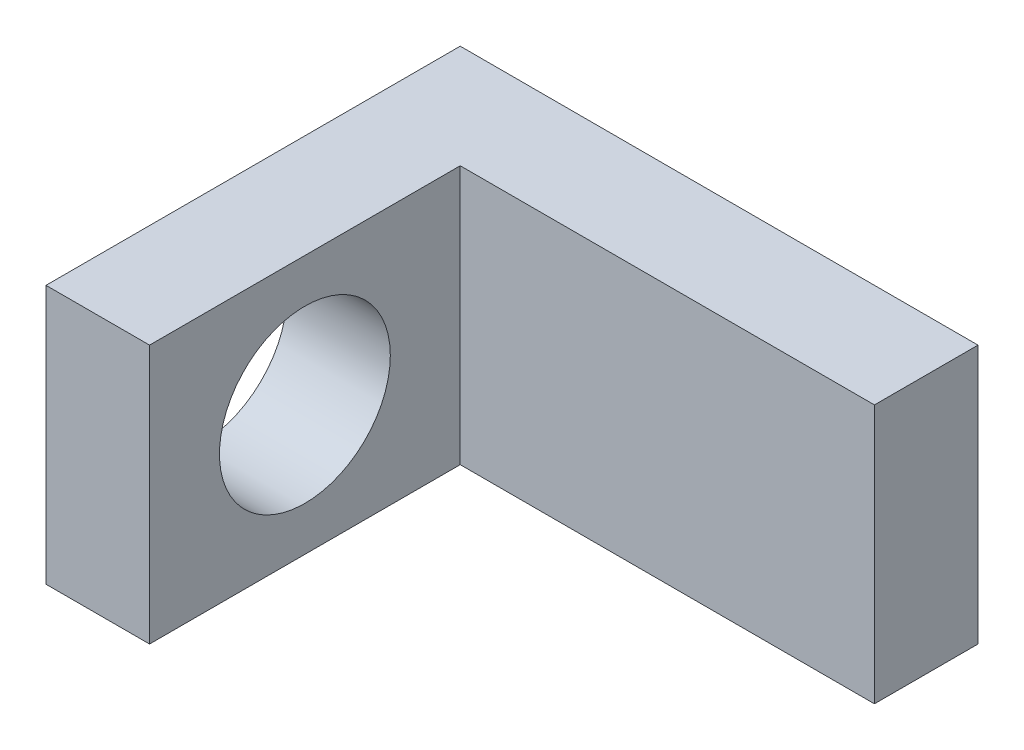
ISO-10303-21;
HEADER;
FILE_DESCRIPTION(('STEP AP214'),'2;1');
FILE_NAME('part.step','',(''),(''),'','','');
FILE_SCHEMA(('AUTOMOTIVE_DESIGN { 1 0 10303 214 1 1 1 1 }'));
ENDSEC;
DATA;
#1=APPLICATION_CONTEXT('core data for automotive mechanical design processes');
#2=APPLICATION_PROTOCOL_DEFINITION('international standard','automotive_design',2000,#1);
#3=PRODUCT_CONTEXT('',#1,'mechanical');
#4=PRODUCT('Part','Part','',(#3));
#5=PRODUCT_RELATED_PRODUCT_CATEGORY('part','',(#4));
#6=PRODUCT_DEFINITION_FORMATION('','',#4);
#7=PRODUCT_DEFINITION_CONTEXT('part definition',#1,'design');
#8=PRODUCT_DEFINITION('design','',#6,#7);
#9=PRODUCT_DEFINITION_SHAPE('','',#8);
#10=(LENGTH_UNIT() NAMED_UNIT(*) SI_UNIT(.MILLI.,.METRE.));
#11=(NAMED_UNIT(*) PLANE_ANGLE_UNIT() SI_UNIT($,.RADIAN.));
#12=(NAMED_UNIT(*) SI_UNIT($,.STERADIAN.) SOLID_ANGLE_UNIT());
#13=UNCERTAINTY_MEASURE_WITH_UNIT(LENGTH_MEASURE(1.E-05),#10,'distance_accuracy_value','');
#14=(GEOMETRIC_REPRESENTATION_CONTEXT(3) GLOBAL_UNCERTAINTY_ASSIGNED_CONTEXT((#13)) GLOBAL_UNIT_ASSIGNED_CONTEXT((#10,
#11,#12)) REPRESENTATION_CONTEXT('',''));
#15=CARTESIAN_POINT('',(0.,0.,0.));
#16=DIRECTION('',(0.,0.,1.));
#17=DIRECTION('',(1.,0.,0.));
#18=AXIS2_PLACEMENT_3D('',#15,#16,#17);
#19=CARTESIAN_POINT('',(10.,5.,0.));
#20=DIRECTION('',(0.,0.,1.));
#21=DIRECTION('',(1.,0.,0.));
#22=AXIS2_PLACEMENT_3D('',#19,#20,#21);
#23=PLANE('',#22);
#24=DIRECTION('',(-1.,0.,0.));
#25=VECTOR('',#24,1.);
#26=CARTESIAN_POINT('',(10.,0.,0.));
#27=LINE('',#26,#25);
#28=CARTESIAN_POINT('',(10.,0.,0.));
#29=VERTEX_POINT('',#28);
#30=CARTESIAN_POINT('',(0.,0.,0.));
#31=VERTEX_POINT('',#30);
#32=EDGE_CURVE('E119',#29,#31,#27,.T.);
#33=ORIENTED_EDGE('',*,*,#32,.T.);
#34=DIRECTION('',(0.,-1.,0.));
#35=VECTOR('',#34,1.);
#36=CARTESIAN_POINT('',(0.,5.,0.));
#37=LINE('',#36,#35);
#38=CARTESIAN_POINT('',(0.,5.,0.));
#39=VERTEX_POINT('',#38);
#40=EDGE_CURVE('E11',#39,#31,#37,.T.);
#41=ORIENTED_EDGE('',*,*,#40,.F.);
#42=DIRECTION('',(-1.,0.,0.));
#43=VECTOR('',#42,1.);
#44=CARTESIAN_POINT('',(10.,5.,0.));
#45=LINE('',#44,#43);
#46=CARTESIAN_POINT('',(10.,5.,0.));
#47=VERTEX_POINT('',#46);
#48=EDGE_CURVE('E130',#47,#39,#45,.T.);
#49=ORIENTED_EDGE('',*,*,#48,.F.);
#50=DIRECTION('',(0.,-1.,0.));
#51=VECTOR('',#50,1.);
#52=CARTESIAN_POINT('',(10.,5.,0.));
#53=LINE('',#52,#51);
#54=EDGE_CURVE('E115',#47,#29,#53,.T.);
#55=ORIENTED_EDGE('',*,*,#54,.T.);
#56=EDGE_LOOP('',(#33,#41,#49,#55));
#57=FACE_BOUND('',#56,.T.);
#58=ADVANCED_FACE('F35',(#57),#23,.F.);
#59=CARTESIAN_POINT('',(0.,5.,0.));
#60=DIRECTION('',(1.,0.,0.));
#61=DIRECTION('',(0.,0.,-1.));
#62=AXIS2_PLACEMENT_3D('',#59,#60,#61);
#63=PLANE('',#62);
#64=CARTESIAN_POINT('',(0.,2.50226053920732,5.));
#65=DIRECTION('',(1.,0.,0.));
#66=DIRECTION('',(0.,0.,-1.));
#67=AXIS2_PLACEMENT_3D('',#64,#65,#66);
#68=CIRCLE('',#67,1.65);
#69=CARTESIAN_POINT('',(0.,2.50226053920732,3.35));
#70=VERTEX_POINT('',#69);
#71=EDGE_CURVE('E123',#70,#70,#68,.T.);
#72=ORIENTED_EDGE('',*,*,#71,.T.);
#73=EDGE_LOOP('',(#72));
#74=FACE_BOUND('',#73,.T.);
#75=DIRECTION('',(0.,0.,1.));
#76=VECTOR('',#75,1.);
#77=CARTESIAN_POINT('',(0.,0.,0.));
#78=LINE('',#77,#76);
#79=CARTESIAN_POINT('',(0.,0.,8.));
#80=VERTEX_POINT('',#79);
#81=EDGE_CURVE('E122',#31,#80,#78,.T.);
#82=ORIENTED_EDGE('',*,*,#81,.T.);
#83=DIRECTION('',(0.,-1.,0.));
#84=VECTOR('',#83,1.);
#85=CARTESIAN_POINT('',(0.,5.,8.));
#86=LINE('',#85,#84);
#87=CARTESIAN_POINT('',(0.,5.,8.));
#88=VERTEX_POINT('',#87);
#89=EDGE_CURVE('E43',#88,#80,#86,.T.);
#90=ORIENTED_EDGE('',*,*,#89,.F.);
#91=DIRECTION('',(0.,0.,1.));
#92=VECTOR('',#91,1.);
#93=CARTESIAN_POINT('',(0.,5.,0.));
#94=LINE('',#93,#92);
#95=EDGE_CURVE('E88',#39,#88,#94,.T.);
#96=ORIENTED_EDGE('',*,*,#95,.F.);
#97=ORIENTED_EDGE('',*,*,#40,.T.);
#98=EDGE_LOOP('',(#82,#90,#96,#97));
#99=FACE_BOUND('',#98,.T.);
#100=ADVANCED_FACE('F154',(#74,#99),#63,.F.);
#101=CARTESIAN_POINT('',(0.,5.,8.));
#102=DIRECTION('',(0.,0.,-1.));
#103=DIRECTION('',(-1.,0.,0.));
#104=AXIS2_PLACEMENT_3D('',#101,#102,#103);
#105=PLANE('',#104);
#106=DIRECTION('',(1.,0.,0.));
#107=VECTOR('',#106,1.);
#108=CARTESIAN_POINT('',(0.,0.,8.));
#109=LINE('',#108,#107);
#110=CARTESIAN_POINT('',(2.,0.,8.));
#111=VERTEX_POINT('',#110);
#112=EDGE_CURVE('E125',#80,#111,#109,.T.);
#113=ORIENTED_EDGE('',*,*,#112,.T.);
#114=DIRECTION('',(0.,-1.,0.));
#115=VECTOR('',#114,1.);
#116=CARTESIAN_POINT('',(2.,5.,8.));
#117=LINE('',#116,#115);
#118=CARTESIAN_POINT('',(2.,5.,8.));
#119=VERTEX_POINT('',#118);
#120=EDGE_CURVE('E110',#119,#111,#117,.T.);
#121=ORIENTED_EDGE('',*,*,#120,.F.);
#122=DIRECTION('',(1.,0.,0.));
#123=VECTOR('',#122,1.);
#124=CARTESIAN_POINT('',(0.,5.,8.));
#125=LINE('',#124,#123);
#126=EDGE_CURVE('E101',#88,#119,#125,.T.);
#127=ORIENTED_EDGE('',*,*,#126,.F.);
#128=ORIENTED_EDGE('',*,*,#89,.T.);
#129=EDGE_LOOP('',(#113,#121,#127,#128));
#130=FACE_BOUND('',#129,.T.);
#131=ADVANCED_FACE('F136',(#130),#105,.F.);
#132=CARTESIAN_POINT('',(2.,5.,8.));
#133=DIRECTION('',(-1.,0.,0.));
#134=DIRECTION('',(0.,0.,1.));
#135=AXIS2_PLACEMENT_3D('',#132,#133,#134);
#136=PLANE('',#135);
#137=CARTESIAN_POINT('',(2.,2.50226053920732,5.));
#138=DIRECTION('',(1.,0.,0.));
#139=DIRECTION('',(0.,0.,-1.));
#140=AXIS2_PLACEMENT_3D('',#137,#138,#139);
#141=CIRCLE('',#140,1.64999999999999);
#142=CARTESIAN_POINT('',(2.,2.50226053920732,3.35000000000001));
#143=VERTEX_POINT('',#142);
#144=EDGE_CURVE('E171',#143,#143,#141,.T.);
#145=ORIENTED_EDGE('',*,*,#144,.F.);
#146=EDGE_LOOP('',(#145));
#147=FACE_BOUND('',#146,.T.);
#148=DIRECTION('',(0.,0.,-1.));
#149=VECTOR('',#148,1.);
#150=CARTESIAN_POINT('',(2.,0.,8.));
#151=LINE('',#150,#149);
#152=CARTESIAN_POINT('',(2.,0.,2.));
#153=VERTEX_POINT('',#152);
#154=EDGE_CURVE('E109',#111,#153,#151,.T.);
#155=ORIENTED_EDGE('',*,*,#154,.T.);
#156=DIRECTION('',(0.,-1.,0.));
#157=VECTOR('',#156,1.);
#158=CARTESIAN_POINT('',(2.,5.,2.));
#159=LINE('',#158,#157);
#160=CARTESIAN_POINT('',(2.,5.,2.));
#161=VERTEX_POINT('',#160);
#162=EDGE_CURVE('E106',#161,#153,#159,.T.);
#163=ORIENTED_EDGE('',*,*,#162,.F.);
#164=DIRECTION('',(0.,0.,-1.));
#165=VECTOR('',#164,1.);
#166=CARTESIAN_POINT('',(2.,5.,8.));
#167=LINE('',#166,#165);
#168=EDGE_CURVE('E95',#119,#161,#167,.T.);
#169=ORIENTED_EDGE('',*,*,#168,.F.);
#170=ORIENTED_EDGE('',*,*,#120,.T.);
#171=EDGE_LOOP('',(#155,#163,#169,#170));
#172=FACE_BOUND('',#171,.T.);
#173=ADVANCED_FACE('F107',(#147,#172),#136,.F.);
#174=CARTESIAN_POINT('',(2.,5.,2.));
#175=DIRECTION('',(0.,0.,-1.));
#176=DIRECTION('',(-1.,0.,0.));
#177=AXIS2_PLACEMENT_3D('',#174,#175,#176);
#178=PLANE('',#177);
#179=DIRECTION('',(1.,0.,0.));
#180=VECTOR('',#179,1.);
#181=CARTESIAN_POINT('',(2.,0.,2.));
#182=LINE('',#181,#180);
#183=CARTESIAN_POINT('',(10.,0.,2.));
#184=VERTEX_POINT('',#183);
#185=EDGE_CURVE('E74',#153,#184,#182,.T.);
#186=ORIENTED_EDGE('',*,*,#185,.T.);
#187=DIRECTION('',(0.,-1.,0.));
#188=VECTOR('',#187,1.);
#189=CARTESIAN_POINT('',(10.,5.,2.));
#190=LINE('',#189,#188);
#191=CARTESIAN_POINT('',(10.,5.,2.));
#192=VERTEX_POINT('',#191);
#193=EDGE_CURVE('E111',#192,#184,#190,.T.);
#194=ORIENTED_EDGE('',*,*,#193,.F.);
#195=DIRECTION('',(1.,0.,0.));
#196=VECTOR('',#195,1.);
#197=CARTESIAN_POINT('',(2.,5.,2.));
#198=LINE('',#197,#196);
#199=EDGE_CURVE('E99',#161,#192,#198,.T.);
#200=ORIENTED_EDGE('',*,*,#199,.F.);
#201=ORIENTED_EDGE('',*,*,#162,.T.);
#202=EDGE_LOOP('',(#186,#194,#200,#201));
#203=FACE_BOUND('',#202,.T.);
#204=ADVANCED_FACE('F113',(#203),#178,.F.);
#205=CARTESIAN_POINT('',(10.,5.,2.));
#206=DIRECTION('',(-1.,0.,0.));
#207=DIRECTION('',(0.,0.,1.));
#208=AXIS2_PLACEMENT_3D('',#205,#206,#207);
#209=PLANE('',#208);
#210=DIRECTION('',(0.,0.,-1.));
#211=VECTOR('',#210,1.);
#212=CARTESIAN_POINT('',(10.,0.,2.));
#213=LINE('',#212,#211);
#214=EDGE_CURVE('E80',#184,#29,#213,.T.);
#215=ORIENTED_EDGE('',*,*,#214,.T.);
#216=ORIENTED_EDGE('',*,*,#54,.F.);
#217=DIRECTION('',(0.,0.,-1.));
#218=VECTOR('',#217,1.);
#219=CARTESIAN_POINT('',(10.,5.,2.));
#220=LINE('',#219,#218);
#221=EDGE_CURVE('E51',#192,#47,#220,.T.);
#222=ORIENTED_EDGE('',*,*,#221,.F.);
#223=ORIENTED_EDGE('',*,*,#193,.T.);
#224=EDGE_LOOP('',(#215,#216,#222,#223));
#225=FACE_BOUND('',#224,.T.);
#226=ADVANCED_FACE('F143',(#225),#209,.F.);
#227=CARTESIAN_POINT('',(0.,5.,0.));
#228=DIRECTION('',(0.,1.,0.));
#229=DIRECTION('',(0.,0.,1.));
#230=AXIS2_PLACEMENT_3D('',#227,#228,#229);
#231=PLANE('',#230);
#232=ORIENTED_EDGE('',*,*,#48,.T.);
#233=ORIENTED_EDGE('',*,*,#95,.T.);
#234=ORIENTED_EDGE('',*,*,#126,.T.);
#235=ORIENTED_EDGE('',*,*,#168,.T.);
#236=ORIENTED_EDGE('',*,*,#199,.T.);
#237=ORIENTED_EDGE('',*,*,#221,.T.);
#238=EDGE_LOOP('',(#232,#233,#234,#235,#236,#237));
#239=FACE_BOUND('',#238,.T.);
#240=ADVANCED_FACE('F97',(#239),#231,.T.);
#241=CARTESIAN_POINT('',(0.,0.,0.));
#242=DIRECTION('',(0.,1.,0.));
#243=DIRECTION('',(0.,0.,1.));
#244=AXIS2_PLACEMENT_3D('',#241,#242,#243);
#245=PLANE('',#244);
#246=ORIENTED_EDGE('',*,*,#32,.F.);
#247=ORIENTED_EDGE('',*,*,#214,.F.);
#248=ORIENTED_EDGE('',*,*,#185,.F.);
#249=ORIENTED_EDGE('',*,*,#154,.F.);
#250=ORIENTED_EDGE('',*,*,#112,.F.);
#251=ORIENTED_EDGE('',*,*,#81,.F.);
#252=EDGE_LOOP('',(#246,#247,#248,#249,#250,#251));
#253=FACE_BOUND('',#252,.T.);
#254=ADVANCED_FACE('F139',(#253),#245,.F.);
#255=CARTESIAN_POINT('',(2.,2.50226053920732,5.));
#256=DIRECTION('',(1.,0.,0.));
#257=DIRECTION('',(0.,0.,-1.));
#258=AXIS2_PLACEMENT_3D('',#255,#256,#257);
#259=CYLINDRICAL_SURFACE('',#258,1.64999999999999);
#260=ORIENTED_EDGE('',*,*,#71,.F.);
#261=EDGE_LOOP('',(#260));
#262=FACE_BOUND('',#261,.T.);
#263=ORIENTED_EDGE('',*,*,#144,.T.);
#264=EDGE_LOOP('',(#263));
#265=FACE_BOUND('',#264,.T.);
#266=ADVANCED_FACE('F179',(#262,#265),#259,.F.);
#267=CLOSED_SHELL('',(#58,#100,#131,#173,#204,#226,#240,#254,#266));
#268=MANIFOLD_SOLID_BREP('B2',#267);
#269=ADVANCED_BREP_SHAPE_REPRESENTATION('',(#18,#268),#14);
#270=SHAPE_DEFINITION_REPRESENTATION(#9,#269);
ENDSEC;
END-ISO-10303-21;
